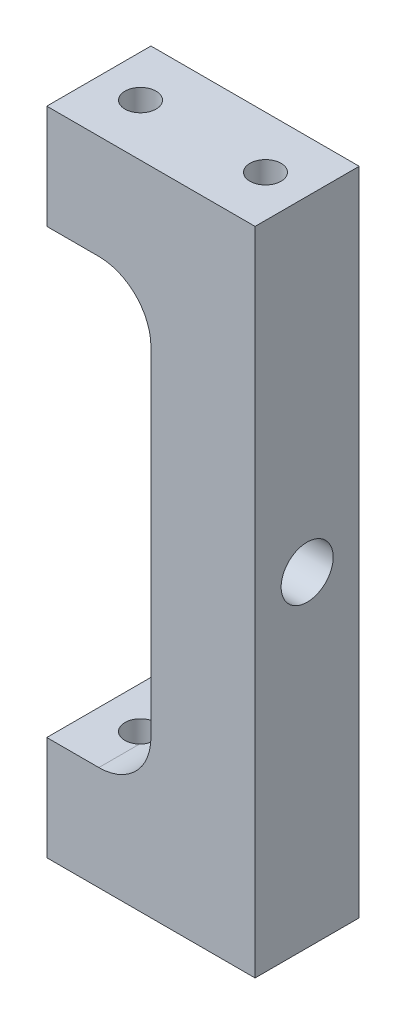
ISO-10303-21;
HEADER;
FILE_DESCRIPTION(('STEP AP214'),'2;1');
FILE_NAME('part.step','',(''),(''),'','','');
FILE_SCHEMA(('AUTOMOTIVE_DESIGN { 1 0 10303 214 1 1 1 1 }'));
ENDSEC;
DATA;
#1=APPLICATION_CONTEXT('core data for automotive mechanical design processes');
#2=APPLICATION_PROTOCOL_DEFINITION('international standard','automotive_design',2000,#1);
#3=PRODUCT_CONTEXT('',#1,'mechanical');
#4=PRODUCT('Part','Part','',(#3));
#5=PRODUCT_RELATED_PRODUCT_CATEGORY('part','',(#4));
#6=PRODUCT_DEFINITION_FORMATION('','',#4);
#7=PRODUCT_DEFINITION_CONTEXT('part definition',#1,'design');
#8=PRODUCT_DEFINITION('design','',#6,#7);
#9=PRODUCT_DEFINITION_SHAPE('','',#8);
#10=(LENGTH_UNIT() NAMED_UNIT(*) SI_UNIT(.MILLI.,.METRE.));
#11=(NAMED_UNIT(*) PLANE_ANGLE_UNIT() SI_UNIT($,.RADIAN.));
#12=(NAMED_UNIT(*) SI_UNIT($,.STERADIAN.) SOLID_ANGLE_UNIT());
#13=UNCERTAINTY_MEASURE_WITH_UNIT(LENGTH_MEASURE(1.E-05),#10,'distance_accuracy_value','');
#14=(GEOMETRIC_REPRESENTATION_CONTEXT(3) GLOBAL_UNCERTAINTY_ASSIGNED_CONTEXT((#13)) GLOBAL_UNIT_ASSIGNED_CONTEXT((#10,
#11,#12)) REPRESENTATION_CONTEXT('',''));
#15=CARTESIAN_POINT('',(0.,0.,0.));
#16=DIRECTION('',(0.,0.,1.));
#17=DIRECTION('',(1.,0.,0.));
#18=AXIS2_PLACEMENT_3D('',#15,#16,#17);
#19=CARTESIAN_POINT('',(0.,79.375,0.));
#20=DIRECTION('',(1.,0.,0.));
#21=DIRECTION('',(0.,0.,-1.));
#22=AXIS2_PLACEMENT_3D('',#19,#20,#21);
#23=PLANE('',#22);
#24=DIRECTION('',(0.,-1.,0.));
#25=VECTOR('',#24,1.);
#26=CARTESIAN_POINT('',(0.,79.375,-12.7));
#27=LINE('',#26,#25);
#28=CARTESIAN_POINT('',(0.,79.375,-12.7));
#29=VERTEX_POINT('',#28);
#30=CARTESIAN_POINT('',(0.,66.675,-12.7));
#31=VERTEX_POINT('',#30);
#32=EDGE_CURVE('E254',#29,#31,#27,.T.);
#33=ORIENTED_EDGE('',*,*,#32,.T.);
#34=DIRECTION('',(0.,0.,1.));
#35=VECTOR('',#34,1.);
#36=CARTESIAN_POINT('',(0.,66.675,-12.7));
#37=LINE('',#36,#35);
#38=CARTESIAN_POINT('',(0.,66.675,0.));
#39=VERTEX_POINT('',#38);
#40=EDGE_CURVE('E257',#31,#39,#37,.T.);
#41=ORIENTED_EDGE('',*,*,#40,.T.);
#42=DIRECTION('',(0.,-1.,0.));
#43=VECTOR('',#42,1.);
#44=CARTESIAN_POINT('',(0.,79.375,0.));
#45=LINE('',#44,#43);
#46=CARTESIAN_POINT('',(0.,79.375,0.));
#47=VERTEX_POINT('',#46);
#48=EDGE_CURVE('E276',#47,#39,#45,.T.);
#49=ORIENTED_EDGE('',*,*,#48,.F.);
#50=DIRECTION('',(0.,0.,1.));
#51=VECTOR('',#50,1.);
#52=CARTESIAN_POINT('',(0.,79.375,0.));
#53=LINE('',#52,#51);
#54=EDGE_CURVE('E260',#29,#47,#53,.T.);
#55=ORIENTED_EDGE('',*,*,#54,.F.);
#56=EDGE_LOOP('',(#33,#41,#49,#55));
#57=FACE_BOUND('',#56,.T.);
#58=ADVANCED_FACE('F43',(#57),#23,.F.);
#59=CARTESIAN_POINT('',(0.,12.7,0.));
#60=VERTEX_POINT('',#59);
#61=CARTESIAN_POINT('',(0.,0.,0.));
#62=VERTEX_POINT('',#61);
#63=EDGE_CURVE('E275',#60,#62,#45,.T.);
#64=ORIENTED_EDGE('',*,*,#63,.F.);
#65=DIRECTION('',(0.,0.,1.));
#66=VECTOR('',#65,1.);
#67=CARTESIAN_POINT('',(0.,12.7,-12.7));
#68=LINE('',#67,#66);
#69=CARTESIAN_POINT('',(0.,12.7,-12.7));
#70=VERTEX_POINT('',#69);
#71=EDGE_CURVE('E295',#70,#60,#68,.T.);
#72=ORIENTED_EDGE('',*,*,#71,.F.);
#73=CARTESIAN_POINT('',(0.,0.,-12.7));
#74=VERTEX_POINT('',#73);
#75=EDGE_CURVE('E263',#70,#74,#27,.T.);
#76=ORIENTED_EDGE('',*,*,#75,.T.);
#77=DIRECTION('',(0.,0.,1.));
#78=VECTOR('',#77,1.);
#79=CARTESIAN_POINT('',(0.,0.,0.));
#80=LINE('',#79,#78);
#81=EDGE_CURVE('E306',#74,#62,#80,.T.);
#82=ORIENTED_EDGE('',*,*,#81,.T.);
#83=EDGE_LOOP('',(#64,#72,#76,#82));
#84=FACE_BOUND('',#83,.T.);
#85=ADVANCED_FACE('F235',(#84),#23,.F.);
#86=CARTESIAN_POINT('',(0.,79.375,0.));
#87=DIRECTION('',(0.,0.,-1.));
#88=DIRECTION('',(-1.,0.,0.));
#89=AXIS2_PLACEMENT_3D('',#86,#87,#88);
#90=PLANE('',#89);
#91=ORIENTED_EDGE('',*,*,#48,.T.);
#92=DIRECTION('',(-1.,0.,0.));
#93=VECTOR('',#92,1.);
#94=CARTESIAN_POINT('',(0.,66.675,0.));
#95=LINE('',#94,#93);
#96=CARTESIAN_POINT('',(6.35,66.675,0.));
#97=VERTEX_POINT('',#96);
#98=EDGE_CURVE('E304',#97,#39,#95,.T.);
#99=ORIENTED_EDGE('',*,*,#98,.F.);
#100=CARTESIAN_POINT('',(6.35,60.325,0.));
#101=DIRECTION('',(0.,0.,-1.));
#102=DIRECTION('',(-1.,0.,0.));
#103=AXIS2_PLACEMENT_3D('',#100,#101,#102);
#104=CIRCLE('',#103,6.35);
#105=CARTESIAN_POINT('',(12.7,60.325,0.));
#106=VERTEX_POINT('',#105);
#107=EDGE_CURVE('E178',#97,#106,#104,.T.);
#108=ORIENTED_EDGE('',*,*,#107,.T.);
#109=DIRECTION('',(0.,1.,0.));
#110=VECTOR('',#109,1.);
#111=CARTESIAN_POINT('',(12.7,66.675,0.));
#112=LINE('',#111,#110);
#113=CARTESIAN_POINT('',(12.7,19.05,0.));
#114=VERTEX_POINT('',#113);
#115=EDGE_CURVE('E284',#114,#106,#112,.T.);
#116=ORIENTED_EDGE('',*,*,#115,.F.);
#117=CARTESIAN_POINT('',(6.35,19.05,0.));
#118=DIRECTION('',(0.,0.,-1.));
#119=DIRECTION('',(-1.,0.,0.));
#120=AXIS2_PLACEMENT_3D('',#117,#118,#119);
#121=CIRCLE('',#120,6.35);
#122=CARTESIAN_POINT('',(6.35,12.7,0.));
#123=VERTEX_POINT('',#122);
#124=EDGE_CURVE('E175',#114,#123,#121,.T.);
#125=ORIENTED_EDGE('',*,*,#124,.T.);
#126=DIRECTION('',(1.,0.,0.));
#127=VECTOR('',#126,1.);
#128=CARTESIAN_POINT('',(0.,12.7,0.));
#129=LINE('',#128,#127);
#130=EDGE_CURVE('E300',#60,#123,#129,.T.);
#131=ORIENTED_EDGE('',*,*,#130,.F.);
#132=ORIENTED_EDGE('',*,*,#63,.T.);
#133=DIRECTION('',(1.,0.,0.));
#134=VECTOR('',#133,1.);
#135=CARTESIAN_POINT('',(0.,0.,0.));
#136=LINE('',#135,#134);
#137=CARTESIAN_POINT('',(25.4,0.,0.));
#138=VERTEX_POINT('',#137);
#139=EDGE_CURVE('E316',#62,#138,#136,.T.);
#140=ORIENTED_EDGE('',*,*,#139,.T.);
#141=DIRECTION('',(0.,-1.,0.));
#142=VECTOR('',#141,1.);
#143=CARTESIAN_POINT('',(25.4,79.375,0.));
#144=LINE('',#143,#142);
#145=CARTESIAN_POINT('',(25.4,79.375,0.));
#146=VERTEX_POINT('',#145);
#147=EDGE_CURVE('E266',#146,#138,#144,.T.);
#148=ORIENTED_EDGE('',*,*,#147,.F.);
#149=DIRECTION('',(1.,0.,0.));
#150=VECTOR('',#149,1.);
#151=CARTESIAN_POINT('',(0.,79.375,0.));
#152=LINE('',#151,#150);
#153=EDGE_CURVE('E309',#47,#146,#152,.T.);
#154=ORIENTED_EDGE('',*,*,#153,.F.);
#155=EDGE_LOOP('',(#91,#99,#108,#116,#125,#131,#132,#140,#148,#154));
#156=FACE_BOUND('',#155,.T.);
#157=ADVANCED_FACE('F231',(#156),#90,.F.);
#158=CARTESIAN_POINT('',(25.4,79.375,0.));
#159=DIRECTION('',(-1.,0.,0.));
#160=DIRECTION('',(0.,0.,1.));
#161=AXIS2_PLACEMENT_3D('',#158,#159,#160);
#162=PLANE('',#161);
#163=CARTESIAN_POINT('',(25.4,39.6875,-6.35));
#164=DIRECTION('',(-1.,0.,0.));
#165=DIRECTION('',(0.,0.,1.));
#166=AXIS2_PLACEMENT_3D('',#163,#164,#165);
#167=CIRCLE('',#166,3.175);
#168=CARTESIAN_POINT('',(25.4,39.6875,-3.175));
#169=VERTEX_POINT('',#168);
#170=EDGE_CURVE('E302',#169,#169,#167,.T.);
#171=ORIENTED_EDGE('',*,*,#170,.T.);
#172=EDGE_LOOP('',(#171));
#173=FACE_BOUND('',#172,.T.);
#174=DIRECTION('',(0.,0.,-1.));
#175=VECTOR('',#174,1.);
#176=CARTESIAN_POINT('',(25.4,0.,0.));
#177=LINE('',#176,#175);
#178=CARTESIAN_POINT('',(25.4,0.,-12.7));
#179=VERTEX_POINT('',#178);
#180=EDGE_CURVE('E317',#138,#179,#177,.T.);
#181=ORIENTED_EDGE('',*,*,#180,.T.);
#182=DIRECTION('',(0.,-1.,0.));
#183=VECTOR('',#182,1.);
#184=CARTESIAN_POINT('',(25.4,79.375,-12.7));
#185=LINE('',#184,#183);
#186=CARTESIAN_POINT('',(25.4,79.375,-12.7));
#187=VERTEX_POINT('',#186);
#188=EDGE_CURVE('E262',#187,#179,#185,.T.);
#189=ORIENTED_EDGE('',*,*,#188,.F.);
#190=DIRECTION('',(0.,0.,-1.));
#191=VECTOR('',#190,1.);
#192=CARTESIAN_POINT('',(25.4,79.375,0.));
#193=LINE('',#192,#191);
#194=EDGE_CURVE('E311',#146,#187,#193,.T.);
#195=ORIENTED_EDGE('',*,*,#194,.F.);
#196=ORIENTED_EDGE('',*,*,#147,.T.);
#197=EDGE_LOOP('',(#181,#189,#195,#196));
#198=FACE_BOUND('',#197,.T.);
#199=ADVANCED_FACE('F227',(#173,#198),#162,.F.);
#200=CARTESIAN_POINT('',(0.,79.375,-12.7));
#201=DIRECTION('',(0.,0.,1.));
#202=DIRECTION('',(1.,0.,0.));
#203=AXIS2_PLACEMENT_3D('',#200,#201,#202);
#204=PLANE('',#203);
#205=DIRECTION('',(1.,0.,0.));
#206=VECTOR('',#205,1.);
#207=CARTESIAN_POINT('',(0.,12.7,-12.7));
#208=LINE('',#207,#206);
#209=CARTESIAN_POINT('',(6.35,12.7,-12.7));
#210=VERTEX_POINT('',#209);
#211=EDGE_CURVE('E289',#70,#210,#208,.T.);
#212=ORIENTED_EDGE('',*,*,#211,.T.);
#213=CARTESIAN_POINT('',(6.35,19.05,-12.7));
#214=DIRECTION('',(0.,0.,1.));
#215=DIRECTION('',(1.,0.,0.));
#216=AXIS2_PLACEMENT_3D('',#213,#214,#215);
#217=CIRCLE('',#216,6.35);
#218=CARTESIAN_POINT('',(12.7,19.05,-12.7));
#219=VERTEX_POINT('',#218);
#220=EDGE_CURVE('E163',#210,#219,#217,.T.);
#221=ORIENTED_EDGE('',*,*,#220,.T.);
#222=DIRECTION('',(0.,1.,0.));
#223=VECTOR('',#222,1.);
#224=CARTESIAN_POINT('',(12.7,66.675,-12.7));
#225=LINE('',#224,#223);
#226=CARTESIAN_POINT('',(12.7,60.325,-12.7));
#227=VERTEX_POINT('',#226);
#228=EDGE_CURVE('E282',#219,#227,#225,.T.);
#229=ORIENTED_EDGE('',*,*,#228,.T.);
#230=CARTESIAN_POINT('',(6.35,60.325,-12.7));
#231=DIRECTION('',(0.,0.,1.));
#232=DIRECTION('',(1.,0.,0.));
#233=AXIS2_PLACEMENT_3D('',#230,#231,#232);
#234=CIRCLE('',#233,6.35);
#235=CARTESIAN_POINT('',(6.35,66.675,-12.7));
#236=VERTEX_POINT('',#235);
#237=EDGE_CURVE('E180',#227,#236,#234,.T.);
#238=ORIENTED_EDGE('',*,*,#237,.T.);
#239=DIRECTION('',(-1.,0.,0.));
#240=VECTOR('',#239,1.);
#241=CARTESIAN_POINT('',(0.,66.675,-12.7));
#242=LINE('',#241,#240);
#243=EDGE_CURVE('E288',#236,#31,#242,.T.);
#244=ORIENTED_EDGE('',*,*,#243,.T.);
#245=ORIENTED_EDGE('',*,*,#32,.F.);
#246=DIRECTION('',(-1.,0.,0.));
#247=VECTOR('',#246,1.);
#248=CARTESIAN_POINT('',(0.,79.375,-12.7));
#249=LINE('',#248,#247);
#250=EDGE_CURVE('E268',#187,#29,#249,.T.);
#251=ORIENTED_EDGE('',*,*,#250,.F.);
#252=ORIENTED_EDGE('',*,*,#188,.T.);
#253=DIRECTION('',(-1.,0.,0.));
#254=VECTOR('',#253,1.);
#255=CARTESIAN_POINT('',(0.,0.,-12.7));
#256=LINE('',#255,#254);
#257=EDGE_CURVE('E270',#179,#74,#256,.T.);
#258=ORIENTED_EDGE('',*,*,#257,.T.);
#259=ORIENTED_EDGE('',*,*,#75,.F.);
#260=EDGE_LOOP('',(#212,#221,#229,#238,#244,#245,#251,#252,#258,#259));
#261=FACE_BOUND('',#260,.T.);
#262=ADVANCED_FACE('F220',(#261),#204,.F.);
#263=CARTESIAN_POINT('',(0.,79.375,0.));
#264=DIRECTION('',(0.,-1.,0.));
#265=DIRECTION('',(0.,0.,-1.));
#266=AXIS2_PLACEMENT_3D('',#263,#264,#265);
#267=PLANE('',#266);
#268=CARTESIAN_POINT('',(5.08,79.375,-6.35));
#269=DIRECTION('',(0.,1.,0.));
#270=DIRECTION('',(0.,0.,1.));
#271=AXIS2_PLACEMENT_3D('',#268,#269,#270);
#272=CIRCLE('',#271,1.89864999999999);
#273=CARTESIAN_POINT('',(5.08,79.375,-4.45135000000001));
#274=VERTEX_POINT('',#273);
#275=EDGE_CURVE('E347',#274,#274,#272,.T.);
#276=ORIENTED_EDGE('',*,*,#275,.F.);
#277=EDGE_LOOP('',(#276));
#278=FACE_BOUND('',#277,.T.);
#279=CARTESIAN_POINT('',(20.32,79.375,-6.35000000000001));
#280=DIRECTION('',(0.,1.,0.));
#281=DIRECTION('',(0.,0.,1.));
#282=AXIS2_PLACEMENT_3D('',#279,#280,#281);
#283=CIRCLE('',#282,1.89864999999999);
#284=CARTESIAN_POINT('',(20.32,79.375,-4.45135000000002));
#285=VERTEX_POINT('',#284);
#286=EDGE_CURVE('E343',#285,#285,#283,.T.);
#287=ORIENTED_EDGE('',*,*,#286,.F.);
#288=EDGE_LOOP('',(#287));
#289=FACE_BOUND('',#288,.T.);
#290=ORIENTED_EDGE('',*,*,#54,.T.);
#291=ORIENTED_EDGE('',*,*,#153,.T.);
#292=ORIENTED_EDGE('',*,*,#194,.T.);
#293=ORIENTED_EDGE('',*,*,#250,.T.);
#294=EDGE_LOOP('',(#290,#291,#292,#293));
#295=FACE_BOUND('',#294,.T.);
#296=ADVANCED_FACE('F217',(#278,#289,#295),#267,.F.);
#297=CARTESIAN_POINT('',(0.,0.,0.));
#298=DIRECTION('',(0.,-1.,0.));
#299=DIRECTION('',(0.,0.,-1.));
#300=AXIS2_PLACEMENT_3D('',#297,#298,#299);
#301=PLANE('',#300);
#302=CARTESIAN_POINT('',(5.08,0.,-6.35));
#303=DIRECTION('',(0.,-1.,0.));
#304=DIRECTION('',(0.,0.,-1.));
#305=AXIS2_PLACEMENT_3D('',#302,#303,#304);
#306=CIRCLE('',#305,1.89864999999999);
#307=CARTESIAN_POINT('',(5.08,0.,-8.24864999999999));
#308=VERTEX_POINT('',#307);
#309=EDGE_CURVE('E159',#308,#308,#306,.T.);
#310=ORIENTED_EDGE('',*,*,#309,.F.);
#311=EDGE_LOOP('',(#310));
#312=FACE_BOUND('',#311,.T.);
#313=CARTESIAN_POINT('',(20.32,0.,-6.35000000000001));
#314=DIRECTION('',(0.,-1.,0.));
#315=DIRECTION('',(0.,0.,-1.));
#316=AXIS2_PLACEMENT_3D('',#313,#314,#315);
#317=CIRCLE('',#316,1.89864999999999);
#318=CARTESIAN_POINT('',(20.32,0.,-8.24865));
#319=VERTEX_POINT('',#318);
#320=EDGE_CURVE('E151',#319,#319,#317,.T.);
#321=ORIENTED_EDGE('',*,*,#320,.F.);
#322=EDGE_LOOP('',(#321));
#323=FACE_BOUND('',#322,.T.);
#324=ORIENTED_EDGE('',*,*,#81,.F.);
#325=ORIENTED_EDGE('',*,*,#257,.F.);
#326=ORIENTED_EDGE('',*,*,#180,.F.);
#327=ORIENTED_EDGE('',*,*,#139,.F.);
#328=EDGE_LOOP('',(#324,#325,#326,#327));
#329=FACE_BOUND('',#328,.T.);
#330=ADVANCED_FACE('F210',(#312,#323,#329),#301,.T.);
#331=CARTESIAN_POINT('',(0.,66.675,-12.7));
#332=DIRECTION('',(0.,1.,0.));
#333=DIRECTION('',(0.,0.,1.));
#334=AXIS2_PLACEMENT_3D('',#331,#332,#333);
#335=PLANE('',#334);
#336=DIRECTION('',(0.,0.,1.));
#337=VECTOR('',#336,1.);
#338=CARTESIAN_POINT('',(6.35,66.675,0.));
#339=LINE('',#338,#337);
#340=CARTESIAN_POINT('',(6.35,66.675,-7.76137231887975));
#341=VERTEX_POINT('',#340);
#342=EDGE_CURVE('E172',#236,#341,#339,.T.);
#343=ORIENTED_EDGE('',*,*,#342,.T.);
#344=CARTESIAN_POINT('',(5.08,66.675,-6.35));
#345=DIRECTION('',(0.,1.,0.));
#346=DIRECTION('',(0.,0.,1.));
#347=AXIS2_PLACEMENT_3D('',#344,#345,#346);
#348=CIRCLE('',#347,1.89865);
#349=CARTESIAN_POINT('',(6.35,66.675,-4.93862768112025));
#350=VERTEX_POINT('',#349);
#351=EDGE_CURVE('E294',#341,#350,#348,.T.);
#352=ORIENTED_EDGE('',*,*,#351,.T.);
#353=EDGE_CURVE('E166',#350,#97,#339,.T.);
#354=ORIENTED_EDGE('',*,*,#353,.T.);
#355=ORIENTED_EDGE('',*,*,#98,.T.);
#356=ORIENTED_EDGE('',*,*,#40,.F.);
#357=ORIENTED_EDGE('',*,*,#243,.F.);
#358=EDGE_LOOP('',(#343,#352,#354,#355,#356,#357));
#359=FACE_BOUND('',#358,.T.);
#360=ADVANCED_FACE('F206',(#359),#335,.F.);
#361=CARTESIAN_POINT('',(12.7,66.675,-12.7));
#362=DIRECTION('',(1.,0.,0.));
#363=DIRECTION('',(0.,0.,-1.));
#364=AXIS2_PLACEMENT_3D('',#361,#362,#363);
#365=PLANE('',#364);
#366=CARTESIAN_POINT('',(12.7,39.6875,-6.35));
#367=DIRECTION('',(-1.,0.,0.));
#368=DIRECTION('',(0.,0.,1.));
#369=AXIS2_PLACEMENT_3D('',#366,#367,#368);
#370=CIRCLE('',#369,3.17499999999998);
#371=CARTESIAN_POINT('',(12.7,39.6875,-3.17500000000002));
#372=VERTEX_POINT('',#371);
#373=EDGE_CURVE('E337',#372,#372,#370,.T.);
#374=ORIENTED_EDGE('',*,*,#373,.F.);
#375=EDGE_LOOP('',(#374));
#376=FACE_BOUND('',#375,.T.);
#377=ORIENTED_EDGE('',*,*,#228,.F.);
#378=DIRECTION('',(0.,0.,1.));
#379=VECTOR('',#378,1.);
#380=CARTESIAN_POINT('',(12.7,19.05,0.));
#381=LINE('',#380,#379);
#382=EDGE_CURVE('E164',#219,#114,#381,.T.);
#383=ORIENTED_EDGE('',*,*,#382,.T.);
#384=ORIENTED_EDGE('',*,*,#115,.T.);
#385=DIRECTION('',(0.,0.,1.));
#386=VECTOR('',#385,1.);
#387=CARTESIAN_POINT('',(12.7,60.325,-12.7));
#388=LINE('',#387,#386);
#389=EDGE_CURVE('E168',#106,#227,#388,.F.);
#390=ORIENTED_EDGE('',*,*,#389,.T.);
#391=EDGE_LOOP('',(#377,#383,#384,#390));
#392=FACE_BOUND('',#391,.T.);
#393=ADVANCED_FACE('F209',(#376,#392),#365,.F.);
#394=CARTESIAN_POINT('',(0.,12.7,-12.7));
#395=DIRECTION('',(0.,-1.,0.));
#396=DIRECTION('',(1.,0.,0.));
#397=AXIS2_PLACEMENT_3D('',#394,#395,#396);
#398=PLANE('',#397);
#399=DIRECTION('',(0.,0.,1.));
#400=VECTOR('',#399,1.);
#401=CARTESIAN_POINT('',(6.35,12.7,-12.7));
#402=LINE('',#401,#400);
#403=CARTESIAN_POINT('',(6.35,12.7,-4.93862768112026));
#404=VERTEX_POINT('',#403);
#405=EDGE_CURVE('E158',#123,#404,#402,.F.);
#406=ORIENTED_EDGE('',*,*,#405,.T.);
#407=CARTESIAN_POINT('',(5.08,12.7,-6.35));
#408=DIRECTION('',(0.,-1.,0.));
#409=DIRECTION('',(0.,0.,-1.));
#410=AXIS2_PLACEMENT_3D('',#407,#408,#409);
#411=CIRCLE('',#410,1.89865);
#412=CARTESIAN_POINT('',(6.35,12.7,-7.76137231887975));
#413=VERTEX_POINT('',#412);
#414=EDGE_CURVE('E150',#404,#413,#411,.T.);
#415=ORIENTED_EDGE('',*,*,#414,.T.);
#416=EDGE_CURVE('E155',#413,#210,#402,.F.);
#417=ORIENTED_EDGE('',*,*,#416,.T.);
#418=ORIENTED_EDGE('',*,*,#211,.F.);
#419=ORIENTED_EDGE('',*,*,#71,.T.);
#420=ORIENTED_EDGE('',*,*,#130,.T.);
#421=EDGE_LOOP('',(#406,#415,#417,#418,#419,#420));
#422=FACE_BOUND('',#421,.T.);
#423=ADVANCED_FACE('F154',(#422),#398,.F.);
#424=CARTESIAN_POINT('',(6.35,19.05,-12.7));
#425=DIRECTION('',(0.,0.,-1.));
#426=DIRECTION('',(-1.,0.,0.));
#427=AXIS2_PLACEMENT_3D('',#424,#425,#426);
#428=CYLINDRICAL_SURFACE('',#427,6.35);
#429=ORIENTED_EDGE('',*,*,#416,.F.);
#430=CARTESIAN_POINT('',(6.286935,12.7003131726222,-7.81499174791714));
#431=CARTESIAN_POINT('',(6.35495668655304,12.6996597814299,-7.76041388413451));
#432=CARTESIAN_POINT('',(6.41780724324587,12.7001072536485,-7.69984625016318));
#433=CARTESIAN_POINT('',(6.53253138231855,12.7023603149361,-7.56965300171887));
#434=CARTESIAN_POINT('',(6.58446414689218,12.7041583266875,-7.50007971019066));
#435=CARTESIAN_POINT('',(6.67850131354621,12.7083253530473,-7.35253285830038));
#436=CARTESIAN_POINT('',(6.7203654367579,12.7107060155712,-7.27440864249751));
#437=CARTESIAN_POINT('',(6.79292209398059,12.7153615480953,-7.11300069223734));
#438=CARTESIAN_POINT('',(6.82359336382674,12.7176362096406,-7.02970748522058));
#439=CARTESIAN_POINT('',(6.87876549211804,12.7219804474696,-6.84293814754952));
#440=CARTESIAN_POINT('',(6.9008340481394,12.7239197504367,-6.73873691525756));
#441=CARTESIAN_POINT('',(6.9291066962574,12.7264465033831,-6.52822206194487));
#442=CARTESIAN_POINT('',(6.93530861311548,12.7270337680035,-6.42190815329976));
#443=CARTESIAN_POINT('',(6.93171708158736,12.7266998166657,-6.19805140623304));
#444=CARTESIAN_POINT('',(6.92012845445814,12.7256092745477,-6.0805327417237));
#445=CARTESIAN_POINT('',(6.87738058705698,12.7219018837013,-5.84891641635566));
#446=CARTESIAN_POINT('',(6.8461930942457,12.7192828319553,-5.73482394369031));
#447=CARTESIAN_POINT('',(6.76412919887965,12.7133846443631,-5.51437713824204));
#448=CARTESIAN_POINT('',(6.71332416136096,12.7101079215165,-5.40799639874128));
#449=CARTESIAN_POINT('',(6.59189291028669,12.7043210386194,-5.20746550943038));
#450=CARTESIAN_POINT('',(6.52136324588299,12.7018072659868,-5.11325897303276));
#451=CARTESIAN_POINT('',(6.41734418823601,12.7003120335445,-5.00253714972984));
#452=CARTESIAN_POINT('',(6.39243273146849,12.7000897165271,-4.97775230094669));
#453=CARTESIAN_POINT('',(6.34093289696033,12.6999541128182,-4.92998649098091));
#454=CARTESIAN_POINT('',(6.31434435672044,12.7000408561182,-4.90700570508682));
#455=CARTESIAN_POINT('',(6.286935,12.7003131726222,-4.88500825208286));
#456=B_SPLINE_CURVE_WITH_KNOTS('',3,(#430,#431,#432,#433,#434,#435,#436,#437,#438,#439,#440,
#441,#442,#443,#444,#445,#446,#447,#448,#449,#450,#451,#452,#453,#454,#455),.UNSPECIFIED.,.F.,
.F.,(4,2,2,2,2,2,2,2,2,2,2,2,4),(0.,0.260856504869425,0.520260283212885,0.785347795967304,
1.05093633157125,1.36922911654171,1.68756553555703,2.04019670674066,2.39333737944139,
2.74520531335371,3.09538017580239,3.20073605016025,3.306102148595),.UNSPECIFIED.);
#457=EDGE_CURVE('E11',#413,#404,#456,.T.);
#458=ORIENTED_EDGE('',*,*,#457,.T.);
#459=ORIENTED_EDGE('',*,*,#405,.F.);
#460=ORIENTED_EDGE('',*,*,#124,.F.);
#461=ORIENTED_EDGE('',*,*,#382,.F.);
#462=ORIENTED_EDGE('',*,*,#220,.F.);
#463=EDGE_LOOP('',(#429,#458,#459,#460,#461,#462));
#464=FACE_BOUND('',#463,.T.);
#465=ADVANCED_FACE('F161',(#464),#428,.F.);
#466=CARTESIAN_POINT('',(6.35,60.325,-12.7));
#467=DIRECTION('',(0.,0.,-1.));
#468=DIRECTION('',(-1.,0.,0.));
#469=AXIS2_PLACEMENT_3D('',#466,#467,#468);
#470=CYLINDRICAL_SURFACE('',#469,6.35);
#471=ORIENTED_EDGE('',*,*,#353,.F.);
#472=CARTESIAN_POINT('',(6.286935,66.6746868273778,-4.88500825208285));
#473=CARTESIAN_POINT('',(6.35495668655304,66.6753402185701,-4.93958611586548));
#474=CARTESIAN_POINT('',(6.41780724324587,66.6748927463514,-5.00015374983681));
#475=CARTESIAN_POINT('',(6.53253138231855,66.6726396850639,-5.13034699828112));
#476=CARTESIAN_POINT('',(6.58446414689218,66.6708416733125,-5.19992028980934));
#477=CARTESIAN_POINT('',(6.67850131354622,66.6666746469527,-5.34746714169962));
#478=CARTESIAN_POINT('',(6.7203654367579,66.6642939844288,-5.42559135750249));
#479=CARTESIAN_POINT('',(6.7929220939806,66.6596384519046,-5.58699930776266));
#480=CARTESIAN_POINT('',(6.82359336382674,66.6573637903594,-5.67029251477941));
#481=CARTESIAN_POINT('',(6.87876549211805,66.6530195525304,-5.85706185245048));
#482=CARTESIAN_POINT('',(6.90083404813941,66.6510802495633,-5.96126308474243));
#483=CARTESIAN_POINT('',(6.9291066962574,66.6485534966169,-6.17177793805512));
#484=CARTESIAN_POINT('',(6.93530861311549,66.6479662319965,-6.27809184670024));
#485=CARTESIAN_POINT('',(6.93171708158737,66.6483001833343,-6.50194859376696));
#486=CARTESIAN_POINT('',(6.92012845445814,66.6493907254523,-6.6194672582763));
#487=CARTESIAN_POINT('',(6.87738058705699,66.6530981162987,-6.85108358364434));
#488=CARTESIAN_POINT('',(6.84619309424571,66.6557171680447,-6.96517605630968));
#489=CARTESIAN_POINT('',(6.76412919887966,66.6616153556369,-7.18562286175795));
#490=CARTESIAN_POINT('',(6.71332416136097,66.6648920784835,-7.29200360125872));
#491=CARTESIAN_POINT('',(6.59189291028669,66.6706789613806,-7.49253449056962));
#492=CARTESIAN_POINT('',(6.52136324588299,66.6731927340132,-7.58674102696724));
#493=CARTESIAN_POINT('',(6.41734418823602,66.6746879664555,-7.69746285027016));
#494=CARTESIAN_POINT('',(6.39243273146849,66.6749102834729,-7.72224769905332));
#495=CARTESIAN_POINT('',(6.34093289696033,66.6750458871818,-7.77001350901909));
#496=CARTESIAN_POINT('',(6.31434435672044,66.6749591438818,-7.79299429491319));
#497=CARTESIAN_POINT('',(6.286935,66.6746868273778,-7.81499174791715));
#498=B_SPLINE_CURVE_WITH_KNOTS('',3,(#472,#473,#474,#475,#476,#477,#478,#479,#480,#481,#482,
#483,#484,#485,#486,#487,#488,#489,#490,#491,#492,#493,#494,#495,#496,#497),.UNSPECIFIED.,.F.,
.F.,(4,2,2,2,2,2,2,2,2,2,2,2,4),(0.,0.260856504869426,0.520260283212887,0.785347795967306,
1.05093633157125,1.36922911654171,1.68756553555703,2.04019670674067,2.39333737944139,
2.74520531335372,3.0953801758024,3.20073605016027,3.30610214859501),.UNSPECIFIED.);
#499=EDGE_CURVE('E57',#350,#341,#498,.T.);
#500=ORIENTED_EDGE('',*,*,#499,.T.);
#501=ORIENTED_EDGE('',*,*,#342,.F.);
#502=ORIENTED_EDGE('',*,*,#237,.F.);
#503=ORIENTED_EDGE('',*,*,#389,.F.);
#504=ORIENTED_EDGE('',*,*,#107,.F.);
#505=EDGE_LOOP('',(#471,#500,#501,#502,#503,#504));
#506=FACE_BOUND('',#505,.T.);
#507=ADVANCED_FACE('F45',(#506),#470,.F.);
#508=CARTESIAN_POINT('',(12.7,39.6875,-6.35));
#509=DIRECTION('',(-1.,0.,0.));
#510=DIRECTION('',(0.,0.,1.));
#511=AXIS2_PLACEMENT_3D('',#508,#509,#510);
#512=CYLINDRICAL_SURFACE('',#511,3.17499999999999);
#513=ORIENTED_EDGE('',*,*,#170,.F.);
#514=EDGE_LOOP('',(#513));
#515=FACE_BOUND('',#514,.T.);
#516=ORIENTED_EDGE('',*,*,#373,.T.);
#517=EDGE_LOOP('',(#516));
#518=FACE_BOUND('',#517,.T.);
#519=ADVANCED_FACE('F201',(#515,#518),#512,.F.);
#520=CARTESIAN_POINT('',(20.32,66.675,-6.35000000000001));
#521=DIRECTION('',(0.,1.,0.));
#522=DIRECTION('',(0.,0.,1.));
#523=AXIS2_PLACEMENT_3D('',#520,#521,#522);
#524=CONICAL_SURFACE('',#523,1.89865,1.02974425867666);
#525=CARTESIAN_POINT('',(20.32,65.5341759856833,-6.35000000000001));
#526=VERTEX_POINT('',#525);
#527=VERTEX_LOOP('',#526);
#528=FACE_BOUND('',#527,.T.);
#529=CARTESIAN_POINT('',(20.32,66.675,-6.35000000000001));
#530=DIRECTION('',(0.,1.,0.));
#531=DIRECTION('',(0.,0.,1.));
#532=AXIS2_PLACEMENT_3D('',#529,#530,#531);
#533=CIRCLE('',#532,1.89865);
#534=CARTESIAN_POINT('',(20.32,66.675,-4.45135000000001));
#535=VERTEX_POINT('',#534);
#536=EDGE_CURVE('E340',#535,#535,#533,.T.);
#537=ORIENTED_EDGE('',*,*,#536,.T.);
#538=EDGE_LOOP('',(#537));
#539=FACE_BOUND('',#538,.T.);
#540=ADVANCED_FACE('F197',(#528,#539),#524,.F.);
#541=CARTESIAN_POINT('',(20.32,79.375,-6.35000000000001));
#542=DIRECTION('',(0.,1.,0.));
#543=DIRECTION('',(0.,0.,1.));
#544=AXIS2_PLACEMENT_3D('',#541,#542,#543);
#545=CYLINDRICAL_SURFACE('',#544,1.89864999999999);
#546=ORIENTED_EDGE('',*,*,#536,.F.);
#547=EDGE_LOOP('',(#546));
#548=FACE_BOUND('',#547,.T.);
#549=ORIENTED_EDGE('',*,*,#286,.T.);
#550=EDGE_LOOP('',(#549));
#551=FACE_BOUND('',#550,.T.);
#552=ADVANCED_FACE('F193',(#548,#551),#545,.F.);
#553=CARTESIAN_POINT('',(5.08,66.675,-6.35));
#554=DIRECTION('',(0.,1.,0.));
#555=DIRECTION('',(0.,0.,1.));
#556=AXIS2_PLACEMENT_3D('',#553,#554,#555);
#557=CONICAL_SURFACE('',#556,1.89865,1.02974425867666);
#558=EDGE_CURVE('E70',#350,#341,#348,.T.);
#559=ORIENTED_EDGE('',*,*,#558,.T.);
#560=ORIENTED_EDGE('',*,*,#499,.F.);
#561=EDGE_LOOP('',(#559,#560));
#562=FACE_BOUND('',#561,.T.);
#563=ADVANCED_FACE('F187',(#562),#557,.F.);
#564=CARTESIAN_POINT('',(5.08,79.375,-6.35));
#565=DIRECTION('',(0.,1.,0.));
#566=DIRECTION('',(0.,0.,1.));
#567=AXIS2_PLACEMENT_3D('',#564,#565,#566);
#568=CYLINDRICAL_SURFACE('',#567,1.89864999999999);
#569=ORIENTED_EDGE('',*,*,#558,.F.);
#570=ORIENTED_EDGE('',*,*,#351,.F.);
#571=EDGE_LOOP('',(#569,#570));
#572=FACE_BOUND('',#571,.T.);
#573=ORIENTED_EDGE('',*,*,#275,.T.);
#574=EDGE_LOOP('',(#573));
#575=FACE_BOUND('',#574,.T.);
#576=ADVANCED_FACE('F192',(#572,#575),#568,.F.);
#577=CARTESIAN_POINT('',(20.32,12.7,-6.35000000000001));
#578=DIRECTION('',(0.,-1.,0.));
#579=DIRECTION('',(0.,0.,-1.));
#580=AXIS2_PLACEMENT_3D('',#577,#578,#579);
#581=CONICAL_SURFACE('',#580,1.89865,1.02974425867665);
#582=CARTESIAN_POINT('',(20.32,13.8408240143167,-6.35000000000001));
#583=VERTEX_POINT('',#582);
#584=VERTEX_LOOP('',#583);
#585=FACE_BOUND('',#584,.T.);
#586=CARTESIAN_POINT('',(20.32,12.7,-6.35000000000001));
#587=DIRECTION('',(0.,-1.,0.));
#588=DIRECTION('',(0.,0.,-1.));
#589=AXIS2_PLACEMENT_3D('',#586,#587,#588);
#590=CIRCLE('',#589,1.89865);
#591=CARTESIAN_POINT('',(20.32,12.7,-8.24865000000001));
#592=VERTEX_POINT('',#591);
#593=EDGE_CURVE('E350',#592,#592,#590,.T.);
#594=ORIENTED_EDGE('',*,*,#593,.T.);
#595=EDGE_LOOP('',(#594));
#596=FACE_BOUND('',#595,.T.);
#597=ADVANCED_FACE('F362',(#585,#596),#581,.F.);
#598=CARTESIAN_POINT('',(20.32,0.,-6.35000000000001));
#599=DIRECTION('',(0.,-1.,0.));
#600=DIRECTION('',(0.,0.,-1.));
#601=AXIS2_PLACEMENT_3D('',#598,#599,#600);
#602=CYLINDRICAL_SURFACE('',#601,1.89864999999999);
#603=ORIENTED_EDGE('',*,*,#593,.F.);
#604=EDGE_LOOP('',(#603));
#605=FACE_BOUND('',#604,.T.);
#606=ORIENTED_EDGE('',*,*,#320,.T.);
#607=EDGE_LOOP('',(#606));
#608=FACE_BOUND('',#607,.T.);
#609=ADVANCED_FACE('F360',(#605,#608),#602,.F.);
#610=CARTESIAN_POINT('',(5.08,12.7,-6.35));
#611=DIRECTION('',(0.,-1.,0.));
#612=DIRECTION('',(0.,0.,-1.));
#613=AXIS2_PLACEMENT_3D('',#610,#611,#612);
#614=CONICAL_SURFACE('',#613,1.89865,1.02974425867665);
#615=EDGE_CURVE('E63',#413,#404,#411,.T.);
#616=ORIENTED_EDGE('',*,*,#615,.T.);
#617=ORIENTED_EDGE('',*,*,#457,.F.);
#618=EDGE_LOOP('',(#616,#617));
#619=FACE_BOUND('',#618,.T.);
#620=ADVANCED_FACE('F141',(#619),#614,.F.);
#621=CARTESIAN_POINT('',(5.08,0.,-6.35));
#622=DIRECTION('',(0.,-1.,0.));
#623=DIRECTION('',(0.,0.,-1.));
#624=AXIS2_PLACEMENT_3D('',#621,#622,#623);
#625=CYLINDRICAL_SURFACE('',#624,1.89864999999999);
#626=ORIENTED_EDGE('',*,*,#615,.F.);
#627=ORIENTED_EDGE('',*,*,#414,.F.);
#628=EDGE_LOOP('',(#626,#627));
#629=FACE_BOUND('',#628,.T.);
#630=ORIENTED_EDGE('',*,*,#309,.T.);
#631=EDGE_LOOP('',(#630));
#632=FACE_BOUND('',#631,.T.);
#633=ADVANCED_FACE('F148',(#629,#632),#625,.F.);
#634=CLOSED_SHELL('',(#58,#85,#157,#199,#262,#296,#330,#360,#393,#423,#465,#507,#519,#540,#552,
#563,#576,#597,#609,#620,#633));
#635=MANIFOLD_SOLID_BREP('B2',#634);
#636=ADVANCED_BREP_SHAPE_REPRESENTATION('',(#18,#635),#14);
#637=SHAPE_DEFINITION_REPRESENTATION(#9,#636);
ENDSEC;
END-ISO-10303-21;
